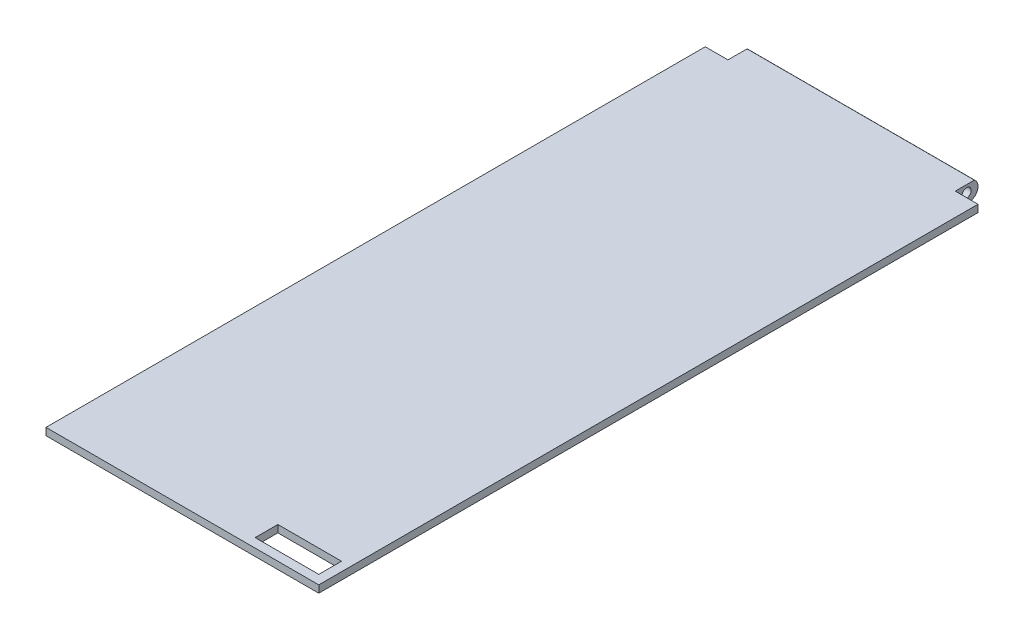
ISO-10303-21;
HEADER;
FILE_DESCRIPTION(('STEP AP214'),'2;1');
FILE_NAME('part.step','',(''),(''),'','','');
FILE_SCHEMA(('AUTOMOTIVE_DESIGN { 1 0 10303 214 1 1 1 1 }'));
ENDSEC;
DATA;
#1=APPLICATION_CONTEXT('core data for automotive mechanical design processes');
#2=APPLICATION_PROTOCOL_DEFINITION('international standard','automotive_design',2000,#1);
#3=PRODUCT_CONTEXT('',#1,'mechanical');
#4=PRODUCT('Part','Part','',(#3));
#5=PRODUCT_RELATED_PRODUCT_CATEGORY('part','',(#4));
#6=PRODUCT_DEFINITION_FORMATION('','',#4);
#7=PRODUCT_DEFINITION_CONTEXT('part definition',#1,'design');
#8=PRODUCT_DEFINITION('design','',#6,#7);
#9=PRODUCT_DEFINITION_SHAPE('','',#8);
#10=(LENGTH_UNIT() NAMED_UNIT(*) SI_UNIT(.MILLI.,.METRE.));
#11=(NAMED_UNIT(*) PLANE_ANGLE_UNIT() SI_UNIT($,.RADIAN.));
#12=(NAMED_UNIT(*) SI_UNIT($,.STERADIAN.) SOLID_ANGLE_UNIT());
#13=UNCERTAINTY_MEASURE_WITH_UNIT(LENGTH_MEASURE(1.E-05),#10,'distance_accuracy_value','');
#14=(GEOMETRIC_REPRESENTATION_CONTEXT(3) GLOBAL_UNCERTAINTY_ASSIGNED_CONTEXT((#13)) GLOBAL_UNIT_ASSIGNED_CONTEXT((#10,
#11,#12)) REPRESENTATION_CONTEXT('',''));
#15=CARTESIAN_POINT('',(0.,0.,0.));
#16=DIRECTION('',(0.,0.,1.));
#17=DIRECTION('',(1.,0.,0.));
#18=AXIS2_PLACEMENT_3D('',#15,#16,#17);
#19=CARTESIAN_POINT('',(-15.,0.,-34.));
#20=DIRECTION('',(1.,0.,0.));
#21=DIRECTION('',(0.,0.,-1.));
#22=AXIS2_PLACEMENT_3D('',#19,#20,#21);
#23=CYLINDRICAL_SURFACE('',#22,1.);
#24=CARTESIAN_POINT('',(-12.5,0.,-34.));
#25=DIRECTION('',(-1.,0.,0.));
#26=DIRECTION('',(0.,0.,1.));
#27=AXIS2_PLACEMENT_3D('',#24,#25,#26);
#28=CIRCLE('',#27,1.);
#29=CARTESIAN_POINT('',(-12.5,0.,-35.));
#30=VERTEX_POINT('',#29);
#31=CARTESIAN_POINT('',(-12.5,0.8,-34.6));
#32=VERTEX_POINT('',#31);
#33=EDGE_CURVE('E204',#30,#32,#28,.F.);
#34=ORIENTED_EDGE('',*,*,#33,.T.);
#35=DIRECTION('',(1.,0.,0.));
#36=VECTOR('',#35,1.);
#37=CARTESIAN_POINT('',(-15.,0.8,-34.6));
#38=LINE('',#37,#36);
#39=CARTESIAN_POINT('',(12.5,0.8,-34.6));
#40=VERTEX_POINT('',#39);
#41=EDGE_CURVE('E207',#32,#40,#38,.T.);
#42=ORIENTED_EDGE('',*,*,#41,.T.);
#43=CARTESIAN_POINT('',(12.5,0.,-34.));
#44=DIRECTION('',(-1.,0.,0.));
#45=DIRECTION('',(0.,0.,1.));
#46=AXIS2_PLACEMENT_3D('',#43,#44,#45);
#47=CIRCLE('',#46,1.);
#48=CARTESIAN_POINT('',(12.5,0.,-35.));
#49=VERTEX_POINT('',#48);
#50=EDGE_CURVE('E206',#49,#40,#47,.F.);
#51=ORIENTED_EDGE('',*,*,#50,.F.);
#52=DIRECTION('',(1.,0.,0.));
#53=VECTOR('',#52,1.);
#54=CARTESIAN_POINT('',(-15.,0.,-35.));
#55=LINE('',#54,#53);
#56=EDGE_CURVE('E186',#30,#49,#55,.T.);
#57=ORIENTED_EDGE('',*,*,#56,.F.);
#58=EDGE_LOOP('',(#34,#42,#51,#57));
#59=FACE_BOUND('',#58,.T.);
#60=ADVANCED_FACE('F47',(#59),#23,.T.);
#61=CARTESIAN_POINT('',(15.,1.,35.));
#62=DIRECTION('',(-1.,0.,0.));
#63=DIRECTION('',(0.,0.,1.));
#64=AXIS2_PLACEMENT_3D('',#61,#62,#63);
#65=PLANE('',#64);
#66=DIRECTION('',(0.,0.,-1.));
#67=VECTOR('',#66,1.);
#68=CARTESIAN_POINT('',(15.,0.8,40.));
#69=LINE('',#68,#67);
#70=CARTESIAN_POINT('',(15.,0.8,40.));
#71=VERTEX_POINT('',#70);
#72=CARTESIAN_POINT('',(15.,0.8,-32.5));
#73=VERTEX_POINT('',#72);
#74=EDGE_CURVE('E69',#71,#73,#69,.T.);
#75=ORIENTED_EDGE('',*,*,#74,.F.);
#76=DIRECTION('',(0.,1.,0.));
#77=VECTOR('',#76,1.);
#78=CARTESIAN_POINT('',(15.,1.,40.));
#79=LINE('',#78,#77);
#80=CARTESIAN_POINT('',(15.,0.,40.));
#81=VERTEX_POINT('',#80);
#82=EDGE_CURVE('E160',#81,#71,#79,.T.);
#83=ORIENTED_EDGE('',*,*,#82,.F.);
#84=DIRECTION('',(0.,0.,-1.));
#85=VECTOR('',#84,1.);
#86=CARTESIAN_POINT('',(15.,0.,35.));
#87=LINE('',#86,#85);
#88=CARTESIAN_POINT('',(15.,0.,-32.5));
#89=VERTEX_POINT('',#88);
#90=EDGE_CURVE('E169',#81,#89,#87,.T.);
#91=ORIENTED_EDGE('',*,*,#90,.T.);
#92=DIRECTION('',(0.,-1.,0.));
#93=VECTOR('',#92,1.);
#94=CARTESIAN_POINT('',(15.,-1.,-32.5));
#95=LINE('',#94,#93);
#96=EDGE_CURVE('E161',#73,#89,#95,.T.);
#97=ORIENTED_EDGE('',*,*,#96,.F.);
#98=EDGE_LOOP('',(#75,#83,#91,#97));
#99=FACE_BOUND('',#98,.T.);
#100=ADVANCED_FACE('F158',(#99),#65,.F.);
#101=CARTESIAN_POINT('',(-15.,1.,35.));
#102=DIRECTION('',(-1.,0.,0.));
#103=DIRECTION('',(0.,0.,1.));
#104=AXIS2_PLACEMENT_3D('',#101,#102,#103);
#105=PLANE('',#104);
#106=DIRECTION('',(0.,-1.,0.));
#107=VECTOR('',#106,1.);
#108=CARTESIAN_POINT('',(-15.,1.,40.));
#109=LINE('',#108,#107);
#110=CARTESIAN_POINT('',(-15.,0.8,40.));
#111=VERTEX_POINT('',#110);
#112=CARTESIAN_POINT('',(-15.,0.,40.));
#113=VERTEX_POINT('',#112);
#114=EDGE_CURVE('E175',#111,#113,#109,.T.);
#115=ORIENTED_EDGE('',*,*,#114,.F.);
#116=DIRECTION('',(0.,0.,-1.));
#117=VECTOR('',#116,1.);
#118=CARTESIAN_POINT('',(-15.,0.8,35.));
#119=LINE('',#118,#117);
#120=CARTESIAN_POINT('',(-15.,0.8,-32.5));
#121=VERTEX_POINT('',#120);
#122=EDGE_CURVE('E148',#111,#121,#119,.T.);
#123=ORIENTED_EDGE('',*,*,#122,.T.);
#124=DIRECTION('',(0.,1.,0.));
#125=VECTOR('',#124,1.);
#126=CARTESIAN_POINT('',(-15.,-1.,-32.5));
#127=LINE('',#126,#125);
#128=CARTESIAN_POINT('',(-15.,0.,-32.5));
#129=VERTEX_POINT('',#128);
#130=EDGE_CURVE('E217',#129,#121,#127,.T.);
#131=ORIENTED_EDGE('',*,*,#130,.F.);
#132=DIRECTION('',(0.,0.,-1.));
#133=VECTOR('',#132,1.);
#134=CARTESIAN_POINT('',(-15.,0.,35.));
#135=LINE('',#134,#133);
#136=EDGE_CURVE('E173',#113,#129,#135,.T.);
#137=ORIENTED_EDGE('',*,*,#136,.F.);
#138=EDGE_LOOP('',(#115,#123,#131,#137));
#139=FACE_BOUND('',#138,.T.);
#140=ADVANCED_FACE('F283',(#139),#105,.T.);
#141=CARTESIAN_POINT('',(0.,0.,40.));
#142=DIRECTION('',(0.,0.,1.));
#143=DIRECTION('',(1.,0.,0.));
#144=AXIS2_PLACEMENT_3D('',#141,#142,#143);
#145=PLANE('',#144);
#146=ORIENTED_EDGE('',*,*,#82,.T.);
#147=DIRECTION('',(1.,0.,0.));
#148=VECTOR('',#147,1.);
#149=CARTESIAN_POINT('',(15.,0.8,40.));
#150=LINE('',#149,#148);
#151=EDGE_CURVE('E145',#111,#71,#150,.T.);
#152=ORIENTED_EDGE('',*,*,#151,.F.);
#153=ORIENTED_EDGE('',*,*,#114,.T.);
#154=DIRECTION('',(1.,0.,0.));
#155=VECTOR('',#154,1.);
#156=CARTESIAN_POINT('',(-15.,0.,40.));
#157=LINE('',#156,#155);
#158=EDGE_CURVE('E167',#113,#81,#157,.T.);
#159=ORIENTED_EDGE('',*,*,#158,.T.);
#160=EDGE_LOOP('',(#146,#152,#153,#159));
#161=FACE_BOUND('',#160,.T.);
#162=ADVANCED_FACE('F165',(#161),#145,.T.);
#163=CARTESIAN_POINT('',(7.,0.,36.5));
#164=DIRECTION('',(-1.,0.,0.));
#165=DIRECTION('',(0.,0.,1.));
#166=AXIS2_PLACEMENT_3D('',#163,#164,#165);
#167=PLANE('',#166);
#168=DIRECTION('',(0.,0.,-1.));
#169=VECTOR('',#168,1.);
#170=CARTESIAN_POINT('',(7.,0.8,36.5));
#171=LINE('',#170,#169);
#172=CARTESIAN_POINT('',(7.,0.8,39.));
#173=VERTEX_POINT('',#172);
#174=CARTESIAN_POINT('',(7.,0.8,36.5));
#175=VERTEX_POINT('',#174);
#176=EDGE_CURVE('E321',#173,#175,#171,.T.);
#177=ORIENTED_EDGE('',*,*,#176,.F.);
#178=DIRECTION('',(0.,1.,0.));
#179=VECTOR('',#178,1.);
#180=CARTESIAN_POINT('',(7.,0.,39.));
#181=LINE('',#180,#179);
#182=CARTESIAN_POINT('',(7.,0.,39.));
#183=VERTEX_POINT('',#182);
#184=EDGE_CURVE('E264',#183,#173,#181,.T.);
#185=ORIENTED_EDGE('',*,*,#184,.F.);
#186=DIRECTION('',(0.,0.,1.));
#187=VECTOR('',#186,1.);
#188=CARTESIAN_POINT('',(7.,0.,36.5));
#189=LINE('',#188,#187);
#190=CARTESIAN_POINT('',(7.,0.,36.5));
#191=VERTEX_POINT('',#190);
#192=EDGE_CURVE('E243',#191,#183,#189,.T.);
#193=ORIENTED_EDGE('',*,*,#192,.F.);
#194=DIRECTION('',(0.,1.,0.));
#195=VECTOR('',#194,1.);
#196=CARTESIAN_POINT('',(7.,0.,36.5));
#197=LINE('',#196,#195);
#198=EDGE_CURVE('E265',#191,#175,#197,.T.);
#199=ORIENTED_EDGE('',*,*,#198,.T.);
#200=EDGE_LOOP('',(#177,#185,#193,#199));
#201=FACE_BOUND('',#200,.T.);
#202=ADVANCED_FACE('F422',(#201),#167,.F.);
#203=CARTESIAN_POINT('',(7.,0.,36.5));
#204=DIRECTION('',(0.,0.,-1.));
#205=DIRECTION('',(-1.,0.,0.));
#206=AXIS2_PLACEMENT_3D('',#203,#204,#205);
#207=PLANE('',#206);
#208=DIRECTION('',(1.,0.,0.));
#209=VECTOR('',#208,1.);
#210=CARTESIAN_POINT('',(7.,0.8,36.5));
#211=LINE('',#210,#209);
#212=CARTESIAN_POINT('',(14.,0.8,36.5));
#213=VERTEX_POINT('',#212);
#214=EDGE_CURVE('E318',#175,#213,#211,.T.);
#215=ORIENTED_EDGE('',*,*,#214,.F.);
#216=ORIENTED_EDGE('',*,*,#198,.F.);
#217=DIRECTION('',(-1.,0.,0.));
#218=VECTOR('',#217,1.);
#219=CARTESIAN_POINT('',(7.,0.,36.5));
#220=LINE('',#219,#218);
#221=CARTESIAN_POINT('',(14.,0.,36.5));
#222=VERTEX_POINT('',#221);
#223=EDGE_CURVE('E260',#222,#191,#220,.T.);
#224=ORIENTED_EDGE('',*,*,#223,.F.);
#225=DIRECTION('',(0.,1.,0.));
#226=VECTOR('',#225,1.);
#227=CARTESIAN_POINT('',(14.,0.,36.5));
#228=LINE('',#227,#226);
#229=EDGE_CURVE('E269',#222,#213,#228,.T.);
#230=ORIENTED_EDGE('',*,*,#229,.T.);
#231=EDGE_LOOP('',(#215,#216,#224,#230));
#232=FACE_BOUND('',#231,.T.);
#233=ADVANCED_FACE('F414',(#232),#207,.F.);
#234=CARTESIAN_POINT('',(14.,0.,36.5));
#235=DIRECTION('',(1.,0.,0.));
#236=DIRECTION('',(0.,0.,-1.));
#237=AXIS2_PLACEMENT_3D('',#234,#235,#236);
#238=PLANE('',#237);
#239=DIRECTION('',(0.,0.,1.));
#240=VECTOR('',#239,1.);
#241=CARTESIAN_POINT('',(14.,0.8,36.5));
#242=LINE('',#241,#240);
#243=CARTESIAN_POINT('',(14.,0.8,39.));
#244=VERTEX_POINT('',#243);
#245=EDGE_CURVE('E62',#213,#244,#242,.T.);
#246=ORIENTED_EDGE('',*,*,#245,.F.);
#247=ORIENTED_EDGE('',*,*,#229,.F.);
#248=DIRECTION('',(0.,0.,-1.));
#249=VECTOR('',#248,1.);
#250=CARTESIAN_POINT('',(14.,0.,36.5));
#251=LINE('',#250,#249);
#252=CARTESIAN_POINT('',(14.,0.,39.));
#253=VERTEX_POINT('',#252);
#254=EDGE_CURVE('E256',#253,#222,#251,.T.);
#255=ORIENTED_EDGE('',*,*,#254,.F.);
#256=DIRECTION('',(0.,1.,0.));
#257=VECTOR('',#256,1.);
#258=CARTESIAN_POINT('',(14.,0.,39.));
#259=LINE('',#258,#257);
#260=EDGE_CURVE('E273',#253,#244,#259,.T.);
#261=ORIENTED_EDGE('',*,*,#260,.T.);
#262=EDGE_LOOP('',(#246,#247,#255,#261));
#263=FACE_BOUND('',#262,.T.);
#264=ADVANCED_FACE('F406',(#263),#238,.F.);
#265=CARTESIAN_POINT('',(7.,0.,39.));
#266=DIRECTION('',(0.,0.,1.));
#267=DIRECTION('',(1.,0.,0.));
#268=AXIS2_PLACEMENT_3D('',#265,#266,#267);
#269=PLANE('',#268);
#270=DIRECTION('',(-1.,0.,0.));
#271=VECTOR('',#270,1.);
#272=CARTESIAN_POINT('',(7.,0.8,39.));
#273=LINE('',#272,#271);
#274=EDGE_CURVE('E309',#244,#173,#273,.T.);
#275=ORIENTED_EDGE('',*,*,#274,.F.);
#276=ORIENTED_EDGE('',*,*,#260,.F.);
#277=DIRECTION('',(1.,0.,0.));
#278=VECTOR('',#277,1.);
#279=CARTESIAN_POINT('',(7.,0.,39.));
#280=LINE('',#279,#278);
#281=EDGE_CURVE('E252',#183,#253,#280,.T.);
#282=ORIENTED_EDGE('',*,*,#281,.F.);
#283=ORIENTED_EDGE('',*,*,#184,.T.);
#284=EDGE_LOOP('',(#275,#276,#282,#283));
#285=FACE_BOUND('',#284,.T.);
#286=ADVANCED_FACE('F373',(#285),#269,.F.);
#287=CARTESIAN_POINT('',(-12.5,-1.,-32.5));
#288=DIRECTION('',(0.,0.,1.));
#289=DIRECTION('',(1.,0.,0.));
#290=AXIS2_PLACEMENT_3D('',#287,#288,#289);
#291=PLANE('',#290);
#292=DIRECTION('',(-1.,0.,0.));
#293=VECTOR('',#292,1.);
#294=CARTESIAN_POINT('',(-12.5,0.8,-32.5));
#295=LINE('',#294,#293);
#296=CARTESIAN_POINT('',(-12.5,0.8,-32.5));
#297=VERTEX_POINT('',#296);
#298=EDGE_CURVE('E304',#297,#121,#295,.T.);
#299=ORIENTED_EDGE('',*,*,#298,.F.);
#300=DIRECTION('',(0.,1.,0.));
#301=VECTOR('',#300,1.);
#302=CARTESIAN_POINT('',(-12.5,-1.,-32.5));
#303=LINE('',#302,#301);
#304=CARTESIAN_POINT('',(-12.5,0.,-32.5));
#305=VERTEX_POINT('',#304);
#306=EDGE_CURVE('E228',#305,#297,#303,.T.);
#307=ORIENTED_EDGE('',*,*,#306,.F.);
#308=DIRECTION('',(1.,0.,0.));
#309=VECTOR('',#308,1.);
#310=CARTESIAN_POINT('',(-15.,0.,-32.5));
#311=LINE('',#310,#309);
#312=EDGE_CURVE('E244',#129,#305,#311,.T.);
#313=ORIENTED_EDGE('',*,*,#312,.F.);
#314=ORIENTED_EDGE('',*,*,#130,.T.);
#315=EDGE_LOOP('',(#299,#307,#313,#314));
#316=FACE_BOUND('',#315,.T.);
#317=ADVANCED_FACE('F303',(#316),#291,.F.);
#318=CARTESIAN_POINT('',(-12.5,0.,0.));
#319=DIRECTION('',(-1.,0.,0.));
#320=DIRECTION('',(0.,0.,1.));
#321=AXIS2_PLACEMENT_3D('',#318,#319,#320);
#322=PLANE('',#321);
#323=CARTESIAN_POINT('',(-12.5,0.,-33.75));
#324=DIRECTION('',(-1.,0.,0.));
#325=DIRECTION('',(0.,0.,1.));
#326=AXIS2_PLACEMENT_3D('',#323,#324,#325);
#327=CIRCLE('',#326,0.499999999999999);
#328=CARTESIAN_POINT('',(-12.5,0.,-33.25));
#329=VERTEX_POINT('',#328);
#330=EDGE_CURVE('E190',#329,#329,#327,.F.);
#331=ORIENTED_EDGE('',*,*,#330,.T.);
#332=EDGE_LOOP('',(#331));
#333=FACE_BOUND('',#332,.T.);
#334=ORIENTED_EDGE('',*,*,#306,.T.);
#335=DIRECTION('',(0.,0.,-1.));
#336=VECTOR('',#335,1.);
#337=CARTESIAN_POINT('',(-12.5,0.8,0.));
#338=LINE('',#337,#336);
#339=EDGE_CURVE('E299',#297,#32,#338,.T.);
#340=ORIENTED_EDGE('',*,*,#339,.T.);
#341=ORIENTED_EDGE('',*,*,#33,.F.);
#342=CARTESIAN_POINT('',(-12.5,0.,-34.));
#343=DIRECTION('',(-1.,0.,0.));
#344=DIRECTION('',(0.,0.,1.));
#345=AXIS2_PLACEMENT_3D('',#342,#343,#344);
#346=CIRCLE('',#345,1.);
#347=CARTESIAN_POINT('',(-12.5,-1.,-34.));
#348=VERTEX_POINT('',#347);
#349=EDGE_CURVE('E55',#348,#30,#346,.F.);
#350=ORIENTED_EDGE('',*,*,#349,.F.);
#351=DIRECTION('',(0.,0.,1.));
#352=VECTOR('',#351,1.);
#353=CARTESIAN_POINT('',(-12.5,-1.,-32.5));
#354=LINE('',#353,#352);
#355=CARTESIAN_POINT('',(-12.5,-1.,-32.5));
#356=VERTEX_POINT('',#355);
#357=EDGE_CURVE('E227',#348,#356,#354,.T.);
#358=ORIENTED_EDGE('',*,*,#357,.T.);
#359=EDGE_CURVE('E223',#356,#305,#303,.T.);
#360=ORIENTED_EDGE('',*,*,#359,.T.);
#361=EDGE_LOOP('',(#334,#340,#341,#350,#358,#360));
#362=FACE_BOUND('',#361,.T.);
#363=ADVANCED_FACE('F298',(#333,#362),#322,.T.);
#364=CARTESIAN_POINT('',(12.5,0.,0.));
#365=DIRECTION('',(-1.,0.,0.));
#366=DIRECTION('',(0.,0.,1.));
#367=AXIS2_PLACEMENT_3D('',#364,#365,#366);
#368=PLANE('',#367);
#369=CARTESIAN_POINT('',(12.5,0.,-33.75));
#370=DIRECTION('',(-1.,0.,0.));
#371=DIRECTION('',(0.,0.,1.));
#372=AXIS2_PLACEMENT_3D('',#369,#370,#371);
#373=CIRCLE('',#372,0.499999999999999);
#374=CARTESIAN_POINT('',(12.5,0.,-33.25));
#375=VERTEX_POINT('',#374);
#376=EDGE_CURVE('E211',#375,#375,#373,.F.);
#377=ORIENTED_EDGE('',*,*,#376,.F.);
#378=EDGE_LOOP('',(#377));
#379=FACE_BOUND('',#378,.T.);
#380=DIRECTION('',(0.,0.,-1.));
#381=VECTOR('',#380,1.);
#382=CARTESIAN_POINT('',(12.5,0.8,0.));
#383=LINE('',#382,#381);
#384=CARTESIAN_POINT('',(12.5,0.8,-32.5));
#385=VERTEX_POINT('',#384);
#386=EDGE_CURVE('E153',#385,#40,#383,.T.);
#387=ORIENTED_EDGE('',*,*,#386,.F.);
#388=DIRECTION('',(0.,-1.,0.));
#389=VECTOR('',#388,1.);
#390=CARTESIAN_POINT('',(12.5,-1.,-32.5));
#391=LINE('',#390,#389);
#392=CARTESIAN_POINT('',(12.5,0.,-32.5));
#393=VERTEX_POINT('',#392);
#394=EDGE_CURVE('E324',#385,#393,#391,.T.);
#395=ORIENTED_EDGE('',*,*,#394,.T.);
#396=CARTESIAN_POINT('',(12.5,-1.,-32.5));
#397=VERTEX_POINT('',#396);
#398=EDGE_CURVE('E327',#393,#397,#391,.T.);
#399=ORIENTED_EDGE('',*,*,#398,.T.);
#400=DIRECTION('',(0.,0.,-1.));
#401=VECTOR('',#400,1.);
#402=CARTESIAN_POINT('',(12.5,-1.,-32.5));
#403=LINE('',#402,#401);
#404=CARTESIAN_POINT('',(12.5,-1.,-34.));
#405=VERTEX_POINT('',#404);
#406=EDGE_CURVE('E219',#397,#405,#403,.T.);
#407=ORIENTED_EDGE('',*,*,#406,.T.);
#408=CARTESIAN_POINT('',(12.5,0.,-34.));
#409=DIRECTION('',(-1.,0.,0.));
#410=DIRECTION('',(0.,0.,1.));
#411=AXIS2_PLACEMENT_3D('',#408,#409,#410);
#412=CIRCLE('',#411,1.);
#413=EDGE_CURVE('E212',#405,#49,#412,.F.);
#414=ORIENTED_EDGE('',*,*,#413,.T.);
#415=ORIENTED_EDGE('',*,*,#50,.T.);
#416=EDGE_LOOP('',(#387,#395,#399,#407,#414,#415));
#417=FACE_BOUND('',#416,.T.);
#418=ADVANCED_FACE('F332',(#379,#417),#368,.F.);
#419=CARTESIAN_POINT('',(12.5,-1.,-32.5));
#420=DIRECTION('',(0.,0.,1.));
#421=DIRECTION('',(1.,0.,0.));
#422=AXIS2_PLACEMENT_3D('',#419,#420,#421);
#423=PLANE('',#422);
#424=DIRECTION('',(-1.,0.,0.));
#425=VECTOR('',#424,1.);
#426=CARTESIAN_POINT('',(12.5,0.8,-32.5));
#427=LINE('',#426,#425);
#428=EDGE_CURVE('E11',#73,#385,#427,.T.);
#429=ORIENTED_EDGE('',*,*,#428,.F.);
#430=ORIENTED_EDGE('',*,*,#96,.T.);
#431=EDGE_CURVE('E189',#393,#89,#311,.T.);
#432=ORIENTED_EDGE('',*,*,#431,.F.);
#433=ORIENTED_EDGE('',*,*,#394,.F.);
#434=EDGE_LOOP('',(#429,#430,#432,#433));
#435=FACE_BOUND('',#434,.T.);
#436=ADVANCED_FACE('F339',(#435),#423,.F.);
#437=CARTESIAN_POINT('',(-15.,-1.,-32.5));
#438=DIRECTION('',(0.,0.,1.));
#439=DIRECTION('',(1.,0.,0.));
#440=AXIS2_PLACEMENT_3D('',#437,#438,#439);
#441=PLANE('',#440);
#442=ORIENTED_EDGE('',*,*,#398,.F.);
#443=EDGE_CURVE('E248',#305,#393,#311,.T.);
#444=ORIENTED_EDGE('',*,*,#443,.F.);
#445=ORIENTED_EDGE('',*,*,#359,.F.);
#446=DIRECTION('',(1.,0.,0.));
#447=VECTOR('',#446,1.);
#448=CARTESIAN_POINT('',(-15.,-1.,-32.5));
#449=LINE('',#448,#447);
#450=EDGE_CURVE('E239',#356,#397,#449,.T.);
#451=ORIENTED_EDGE('',*,*,#450,.T.);
#452=EDGE_LOOP('',(#442,#444,#445,#451));
#453=FACE_BOUND('',#452,.T.);
#454=ADVANCED_FACE('F337',(#453),#441,.T.);
#455=CARTESIAN_POINT('',(0.,-1.,0.));
#456=DIRECTION('',(0.,1.,0.));
#457=DIRECTION('',(0.,0.,1.));
#458=AXIS2_PLACEMENT_3D('',#455,#456,#457);
#459=PLANE('',#458);
#460=DIRECTION('',(1.,0.,0.));
#461=VECTOR('',#460,1.);
#462=CARTESIAN_POINT('',(15.,-1.,-34.));
#463=LINE('',#462,#461);
#464=EDGE_CURVE('E182',#348,#405,#463,.T.);
#465=ORIENTED_EDGE('',*,*,#464,.T.);
#466=ORIENTED_EDGE('',*,*,#406,.F.);
#467=ORIENTED_EDGE('',*,*,#450,.F.);
#468=ORIENTED_EDGE('',*,*,#357,.F.);
#469=EDGE_LOOP('',(#465,#466,#467,#468));
#470=FACE_BOUND('',#469,.T.);
#471=ADVANCED_FACE('F336',(#470),#459,.F.);
#472=CARTESIAN_POINT('',(15.,0.,-33.75));
#473=DIRECTION('',(-1.,0.,0.));
#474=DIRECTION('',(0.,0.,1.));
#475=AXIS2_PLACEMENT_3D('',#472,#473,#474);
#476=CYLINDRICAL_SURFACE('',#475,0.499999999999999);
#477=ORIENTED_EDGE('',*,*,#376,.T.);
#478=EDGE_LOOP('',(#477));
#479=FACE_BOUND('',#478,.T.);
#480=ORIENTED_EDGE('',*,*,#330,.F.);
#481=EDGE_LOOP('',(#480));
#482=FACE_BOUND('',#481,.T.);
#483=ADVANCED_FACE('F344',(#479,#482),#476,.F.);
#484=CARTESIAN_POINT('',(0.,0.,-34.));
#485=DIRECTION('',(-1.,0.,0.));
#486=DIRECTION('',(0.,0.,1.));
#487=AXIS2_PLACEMENT_3D('',#484,#485,#486);
#488=CYLINDRICAL_SURFACE('',#487,1.);
#489=ORIENTED_EDGE('',*,*,#413,.F.);
#490=ORIENTED_EDGE('',*,*,#464,.F.);
#491=ORIENTED_EDGE('',*,*,#349,.T.);
#492=ORIENTED_EDGE('',*,*,#56,.T.);
#493=EDGE_LOOP('',(#489,#490,#491,#492));
#494=FACE_BOUND('',#493,.T.);
#495=ADVANCED_FACE('F197',(#494),#488,.T.);
#496=CARTESIAN_POINT('',(0.,0.,0.));
#497=DIRECTION('',(0.,1.,0.));
#498=DIRECTION('',(0.,0.,1.));
#499=AXIS2_PLACEMENT_3D('',#496,#497,#498);
#500=PLANE('',#499);
#501=ORIENTED_EDGE('',*,*,#223,.T.);
#502=ORIENTED_EDGE('',*,*,#192,.T.);
#503=ORIENTED_EDGE('',*,*,#281,.T.);
#504=ORIENTED_EDGE('',*,*,#254,.T.);
#505=EDGE_LOOP('',(#501,#502,#503,#504));
#506=FACE_BOUND('',#505,.T.);
#507=ORIENTED_EDGE('',*,*,#136,.T.);
#508=ORIENTED_EDGE('',*,*,#312,.T.);
#509=ORIENTED_EDGE('',*,*,#443,.T.);
#510=ORIENTED_EDGE('',*,*,#431,.T.);
#511=ORIENTED_EDGE('',*,*,#90,.F.);
#512=ORIENTED_EDGE('',*,*,#158,.F.);
#513=EDGE_LOOP('',(#507,#508,#509,#510,#511,#512));
#514=FACE_BOUND('',#513,.T.);
#515=ADVANCED_FACE('F285',(#506,#514),#500,.F.);
#516=CARTESIAN_POINT('',(0.,0.8,0.));
#517=DIRECTION('',(0.,1.,0.));
#518=DIRECTION('',(0.,0.,1.));
#519=AXIS2_PLACEMENT_3D('',#516,#517,#518);
#520=PLANE('',#519);
#521=ORIENTED_EDGE('',*,*,#151,.T.);
#522=ORIENTED_EDGE('',*,*,#74,.T.);
#523=ORIENTED_EDGE('',*,*,#428,.T.);
#524=ORIENTED_EDGE('',*,*,#386,.T.);
#525=ORIENTED_EDGE('',*,*,#41,.F.);
#526=ORIENTED_EDGE('',*,*,#339,.F.);
#527=ORIENTED_EDGE('',*,*,#298,.T.);
#528=ORIENTED_EDGE('',*,*,#122,.F.);
#529=EDGE_LOOP('',(#521,#522,#523,#524,#525,#526,#527,#528));
#530=FACE_BOUND('',#529,.T.);
#531=ORIENTED_EDGE('',*,*,#176,.T.);
#532=ORIENTED_EDGE('',*,*,#214,.T.);
#533=ORIENTED_EDGE('',*,*,#245,.T.);
#534=ORIENTED_EDGE('',*,*,#274,.T.);
#535=EDGE_LOOP('',(#531,#532,#533,#534));
#536=FACE_BOUND('',#535,.T.);
#537=ADVANCED_FACE('F146',(#530,#536),#520,.T.);
#538=CLOSED_SHELL('',(#60,#100,#140,#162,#202,#233,#264,#286,#317,#363,#418,#436,#454,#471,#483,
#495,#515,#537));
#539=MANIFOLD_SOLID_BREP('B2',#538);
#540=ADVANCED_BREP_SHAPE_REPRESENTATION('',(#18,#539),#14);
#541=SHAPE_DEFINITION_REPRESENTATION(#9,#540);
ENDSEC;
END-ISO-10303-21;
